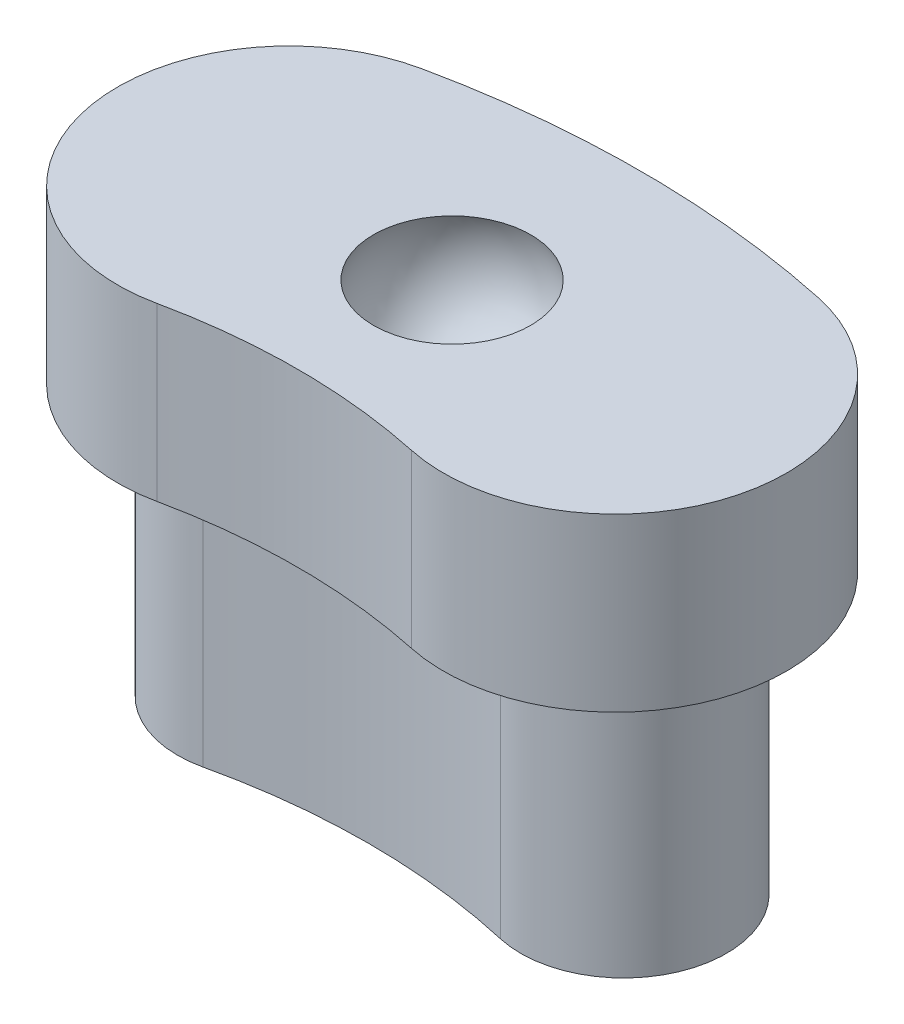
ISO-10303-21;
HEADER;
FILE_DESCRIPTION(('STEP AP214'),'2;1');
FILE_NAME('part.step','',(''),(''),'','','');
FILE_SCHEMA(('AUTOMOTIVE_DESIGN { 1 0 10303 214 1 1 1 1 }'));
ENDSEC;
DATA;
#1=APPLICATION_CONTEXT('core data for automotive mechanical design processes');
#2=APPLICATION_PROTOCOL_DEFINITION('international standard','automotive_design',2000,#1);
#3=PRODUCT_CONTEXT('',#1,'mechanical');
#4=PRODUCT('Part','Part','',(#3));
#5=PRODUCT_RELATED_PRODUCT_CATEGORY('part','',(#4));
#6=PRODUCT_DEFINITION_FORMATION('','',#4);
#7=PRODUCT_DEFINITION_CONTEXT('part definition',#1,'design');
#8=PRODUCT_DEFINITION('design','',#6,#7);
#9=PRODUCT_DEFINITION_SHAPE('','',#8);
#10=(LENGTH_UNIT() NAMED_UNIT(*) SI_UNIT(.MILLI.,.METRE.));
#11=(NAMED_UNIT(*) PLANE_ANGLE_UNIT() SI_UNIT($,.RADIAN.));
#12=(NAMED_UNIT(*) SI_UNIT($,.STERADIAN.) SOLID_ANGLE_UNIT());
#13=UNCERTAINTY_MEASURE_WITH_UNIT(LENGTH_MEASURE(1.E-05),#10,'distance_accuracy_value','');
#14=(GEOMETRIC_REPRESENTATION_CONTEXT(3) GLOBAL_UNCERTAINTY_ASSIGNED_CONTEXT((#13)) GLOBAL_UNIT_ASSIGNED_CONTEXT((#10,
#11,#12)) REPRESENTATION_CONTEXT('',''));
#15=CARTESIAN_POINT('',(0.,0.,0.));
#16=DIRECTION('',(0.,0.,1.));
#17=DIRECTION('',(1.,0.,0.));
#18=AXIS2_PLACEMENT_3D('',#15,#16,#17);
#19=CARTESIAN_POINT('',(4.75,5.,0.));
#20=DIRECTION('',(0.,-1.,0.));
#21=DIRECTION('',(0.,0.,-1.));
#22=AXIS2_PLACEMENT_3D('',#19,#20,#21);
#23=CYLINDRICAL_SURFACE('',#22,5.00000000000001);
#24=CARTESIAN_POINT('',(4.75,0.,0.));
#25=DIRECTION('',(0.,1.,0.));
#26=DIRECTION('',(0.,0.,1.));
#27=AXIS2_PLACEMENT_3D('',#24,#25,#26);
#28=CIRCLE('',#27,5.00000000000001);
#29=CARTESIAN_POINT('',(3.70890410958904,0.,4.89041095890411));
#30=VERTEX_POINT('',#29);
#31=CARTESIAN_POINT('',(5.79109589041095,0.,-4.89041095890412));
#32=VERTEX_POINT('',#31);
#33=EDGE_CURVE('E123',#30,#32,#28,.T.);
#34=ORIENTED_EDGE('',*,*,#33,.T.);
#35=DIRECTION('',(0.,-1.,0.));
#36=VECTOR('',#35,1.);
#37=CARTESIAN_POINT('',(5.79109589041095,5.,-4.89041095890412));
#38=LINE('',#37,#36);
#39=CARTESIAN_POINT('',(5.79109589041095,5.,-4.89041095890412));
#40=VERTEX_POINT('',#39);
#41=EDGE_CURVE('E11',#40,#32,#38,.T.);
#42=ORIENTED_EDGE('',*,*,#41,.F.);
#43=CARTESIAN_POINT('',(4.75,5.,0.));
#44=DIRECTION('',(0.,1.,0.));
#45=DIRECTION('',(0.,0.,1.));
#46=AXIS2_PLACEMENT_3D('',#43,#44,#45);
#47=CIRCLE('',#46,5.00000000000001);
#48=CARTESIAN_POINT('',(3.70890410958904,5.,4.89041095890411));
#49=VERTEX_POINT('',#48);
#50=EDGE_CURVE('E132',#49,#40,#47,.T.);
#51=ORIENTED_EDGE('',*,*,#50,.F.);
#52=DIRECTION('',(0.,-1.,0.));
#53=VECTOR('',#52,1.);
#54=CARTESIAN_POINT('',(3.70890410958904,5.,4.89041095890411));
#55=LINE('',#54,#53);
#56=EDGE_CURVE('E141',#49,#30,#55,.T.);
#57=ORIENTED_EDGE('',*,*,#56,.T.);
#58=EDGE_LOOP('',(#34,#42,#51,#57));
#59=FACE_BOUND('',#58,.T.);
#60=ADVANCED_FACE('F38',(#59),#23,.T.);
#61=CARTESIAN_POINT('',(0.,5.,22.3125));
#62=DIRECTION('',(0.,-1.,0.));
#63=DIRECTION('',(0.,0.,-1.));
#64=AXIS2_PLACEMENT_3D('',#61,#62,#63);
#65=CYLINDRICAL_SURFACE('',#64,27.8125);
#66=CARTESIAN_POINT('',(0.,0.,22.3125));
#67=DIRECTION('',(0.,1.,0.));
#68=DIRECTION('',(0.,0.,1.));
#69=AXIS2_PLACEMENT_3D('',#66,#67,#68);
#70=CIRCLE('',#69,27.8125);
#71=CARTESIAN_POINT('',(-5.79109589041095,0.,-4.89041095890412));
#72=VERTEX_POINT('',#71);
#73=EDGE_CURVE('E126',#32,#72,#70,.T.);
#74=ORIENTED_EDGE('',*,*,#73,.T.);
#75=DIRECTION('',(0.,-1.,0.));
#76=VECTOR('',#75,1.);
#77=CARTESIAN_POINT('',(-5.79109589041095,5.,-4.89041095890412));
#78=LINE('',#77,#76);
#79=CARTESIAN_POINT('',(-5.79109589041095,5.,-4.89041095890412));
#80=VERTEX_POINT('',#79);
#81=EDGE_CURVE('E46',#80,#72,#78,.T.);
#82=ORIENTED_EDGE('',*,*,#81,.F.);
#83=CARTESIAN_POINT('',(0.,5.,22.3125));
#84=DIRECTION('',(0.,1.,0.));
#85=DIRECTION('',(0.,0.,1.));
#86=AXIS2_PLACEMENT_3D('',#83,#84,#85);
#87=CIRCLE('',#86,27.8125);
#88=EDGE_CURVE('E135',#40,#80,#87,.T.);
#89=ORIENTED_EDGE('',*,*,#88,.F.);
#90=ORIENTED_EDGE('',*,*,#41,.T.);
#91=EDGE_LOOP('',(#74,#82,#89,#90));
#92=FACE_BOUND('',#91,.T.);
#93=ADVANCED_FACE('F173',(#92),#65,.T.);
#94=CARTESIAN_POINT('',(-4.75,5.,0.));
#95=DIRECTION('',(0.,-1.,0.));
#96=DIRECTION('',(0.,0.,-1.));
#97=AXIS2_PLACEMENT_3D('',#94,#95,#96);
#98=CYLINDRICAL_SURFACE('',#97,5.00000000000001);
#99=CARTESIAN_POINT('',(-4.75,0.,0.));
#100=DIRECTION('',(0.,1.,0.));
#101=DIRECTION('',(0.,0.,1.));
#102=AXIS2_PLACEMENT_3D('',#99,#100,#101);
#103=CIRCLE('',#102,5.00000000000001);
#104=CARTESIAN_POINT('',(-3.70890410958904,0.,4.89041095890412));
#105=VERTEX_POINT('',#104);
#106=EDGE_CURVE('E144',#72,#105,#103,.T.);
#107=ORIENTED_EDGE('',*,*,#106,.T.);
#108=DIRECTION('',(0.,-1.,0.));
#109=VECTOR('',#108,1.);
#110=CARTESIAN_POINT('',(-3.70890410958904,5.,4.89041095890412));
#111=LINE('',#110,#109);
#112=CARTESIAN_POINT('',(-3.70890410958904,5.,4.89041095890412));
#113=VERTEX_POINT('',#112);
#114=EDGE_CURVE('E149',#113,#105,#111,.T.);
#115=ORIENTED_EDGE('',*,*,#114,.F.);
#116=CARTESIAN_POINT('',(-4.75,5.,0.));
#117=DIRECTION('',(0.,1.,0.));
#118=DIRECTION('',(0.,0.,1.));
#119=AXIS2_PLACEMENT_3D('',#116,#117,#118);
#120=CIRCLE('',#119,5.00000000000001);
#121=EDGE_CURVE('E138',#80,#113,#120,.T.);
#122=ORIENTED_EDGE('',*,*,#121,.F.);
#123=ORIENTED_EDGE('',*,*,#81,.T.);
#124=EDGE_LOOP('',(#107,#115,#122,#123));
#125=FACE_BOUND('',#124,.T.);
#126=ADVANCED_FACE('F157',(#125),#98,.T.);
#127=CARTESIAN_POINT('',(0.,5.,22.3125));
#128=DIRECTION('',(0.,-1.,0.));
#129=DIRECTION('',(0.,0.,-1.));
#130=AXIS2_PLACEMENT_3D('',#127,#128,#129);
#131=CYLINDRICAL_SURFACE('',#130,17.8125);
#132=CARTESIAN_POINT('',(0.,0.,22.3125));
#133=DIRECTION('',(0.,-1.,0.));
#134=DIRECTION('',(0.,0.,1.));
#135=AXIS2_PLACEMENT_3D('',#132,#133,#134);
#136=CIRCLE('',#135,17.8125);
#137=EDGE_CURVE('E136',#105,#30,#136,.T.);
#138=ORIENTED_EDGE('',*,*,#137,.T.);
#139=ORIENTED_EDGE('',*,*,#56,.F.);
#140=CARTESIAN_POINT('',(0.,5.,22.3125));
#141=DIRECTION('',(0.,-1.,0.));
#142=DIRECTION('',(0.,0.,1.));
#143=AXIS2_PLACEMENT_3D('',#140,#141,#142);
#144=CIRCLE('',#143,17.8125);
#145=EDGE_CURVE('E140',#113,#49,#144,.T.);
#146=ORIENTED_EDGE('',*,*,#145,.F.);
#147=ORIENTED_EDGE('',*,*,#114,.T.);
#148=EDGE_LOOP('',(#138,#139,#146,#147));
#149=FACE_BOUND('',#148,.T.);
#150=ADVANCED_FACE('F166',(#149),#131,.F.);
#151=CARTESIAN_POINT('',(2.375,5.,11.15625));
#152=DIRECTION('',(0.,1.,0.));
#153=DIRECTION('',(0.,0.,1.));
#154=AXIS2_PLACEMENT_3D('',#151,#152,#153);
#155=PLANE('',#154);
#156=CARTESIAN_POINT('',(0.,5.,0.));
#157=DIRECTION('',(0.,1.,0.));
#158=DIRECTION('',(0.,0.,1.));
#159=AXIS2_PLACEMENT_3D('',#156,#157,#158);
#160=CIRCLE('',#159,2.29128784747792);
#161=CARTESIAN_POINT('',(0.,5.,2.29128784747792));
#162=VERTEX_POINT('',#161);
#163=EDGE_CURVE('E41',#162,#162,#160,.T.);
#164=ORIENTED_EDGE('',*,*,#163,.F.);
#165=EDGE_LOOP('',(#164));
#166=FACE_BOUND('',#165,.T.);
#167=ORIENTED_EDGE('',*,*,#50,.T.);
#168=ORIENTED_EDGE('',*,*,#88,.T.);
#169=ORIENTED_EDGE('',*,*,#121,.T.);
#170=ORIENTED_EDGE('',*,*,#145,.T.);
#171=EDGE_LOOP('',(#167,#168,#169,#170));
#172=FACE_BOUND('',#171,.T.);
#173=ADVANCED_FACE('F172',(#166,#172),#155,.T.);
#174=CARTESIAN_POINT('',(2.375,0.,11.15625));
#175=DIRECTION('',(0.,1.,0.));
#176=DIRECTION('',(0.,0.,1.));
#177=AXIS2_PLACEMENT_3D('',#174,#175,#176);
#178=PLANE('',#177);
#179=CARTESIAN_POINT('',(-5.,0.,0.));
#180=DIRECTION('',(0.,-1.,0.));
#181=DIRECTION('',(0.,0.,-1.));
#182=AXIS2_PLACEMENT_3D('',#179,#180,#181);
#183=CIRCLE('',#182,3.);
#184=CARTESIAN_POINT('',(-4.33333333333333,0.,2.92498812913072));
#185=VERTEX_POINT('',#184);
#186=CARTESIAN_POINT('',(-5.66666666666667,0.,-2.92498812913071));
#187=VERTEX_POINT('',#186);
#188=EDGE_CURVE('E53',#185,#187,#183,.T.);
#189=ORIENTED_EDGE('',*,*,#188,.F.);
#190=CARTESIAN_POINT('',(0.,0.,21.9374109684803));
#191=DIRECTION('',(0.,1.,0.));
#192=DIRECTION('',(0.,0.,-1.));
#193=AXIS2_PLACEMENT_3D('',#190,#191,#192);
#194=CIRCLE('',#193,19.5);
#195=CARTESIAN_POINT('',(4.33333333333334,0.,2.92498812913071));
#196=VERTEX_POINT('',#195);
#197=EDGE_CURVE('E57',#196,#185,#194,.T.);
#198=ORIENTED_EDGE('',*,*,#197,.F.);
#199=CARTESIAN_POINT('',(5.,0.,0.));
#200=DIRECTION('',(0.,-1.,0.));
#201=DIRECTION('',(0.,0.,-1.));
#202=AXIS2_PLACEMENT_3D('',#199,#200,#201);
#203=CIRCLE('',#202,3.);
#204=CARTESIAN_POINT('',(5.66666666666667,0.,-2.92498812913071));
#205=VERTEX_POINT('',#204);
#206=EDGE_CURVE('E211',#205,#196,#203,.T.);
#207=ORIENTED_EDGE('',*,*,#206,.F.);
#208=CARTESIAN_POINT('',(0.,0.,21.9374109684803));
#209=DIRECTION('',(0.,-1.,0.));
#210=DIRECTION('',(0.,0.,-1.));
#211=AXIS2_PLACEMENT_3D('',#208,#209,#210);
#212=CIRCLE('',#211,25.5);
#213=EDGE_CURVE('E209',#187,#205,#212,.T.);
#214=ORIENTED_EDGE('',*,*,#213,.F.);
#215=EDGE_LOOP('',(#189,#198,#207,#214));
#216=FACE_BOUND('',#215,.T.);
#217=ORIENTED_EDGE('',*,*,#33,.F.);
#218=ORIENTED_EDGE('',*,*,#137,.F.);
#219=ORIENTED_EDGE('',*,*,#106,.F.);
#220=ORIENTED_EDGE('',*,*,#73,.F.);
#221=EDGE_LOOP('',(#217,#218,#219,#220));
#222=FACE_BOUND('',#221,.T.);
#223=ADVANCED_FACE('F163',(#216,#222),#178,.F.);
#224=CARTESIAN_POINT('',(-5.,-8.,0.));
#225=DIRECTION('',(0.,1.,0.));
#226=DIRECTION('',(0.,0.,1.));
#227=AXIS2_PLACEMENT_3D('',#224,#225,#226);
#228=CYLINDRICAL_SURFACE('',#227,3.);
#229=ORIENTED_EDGE('',*,*,#188,.T.);
#230=DIRECTION('',(0.,1.,0.));
#231=VECTOR('',#230,1.);
#232=CARTESIAN_POINT('',(-5.66666666666667,-8.,-2.92498812913071));
#233=LINE('',#232,#231);
#234=CARTESIAN_POINT('',(-5.66666666666667,-8.,-2.92498812913071));
#235=VERTEX_POINT('',#234);
#236=EDGE_CURVE('E106',#235,#187,#233,.T.);
#237=ORIENTED_EDGE('',*,*,#236,.F.);
#238=CARTESIAN_POINT('',(-5.,-8.,0.));
#239=DIRECTION('',(0.,-1.,0.));
#240=DIRECTION('',(0.,0.,-1.));
#241=AXIS2_PLACEMENT_3D('',#238,#239,#240);
#242=CIRCLE('',#241,3.);
#243=CARTESIAN_POINT('',(-4.33333333333333,-8.,2.92498812913072));
#244=VERTEX_POINT('',#243);
#245=EDGE_CURVE('E112',#244,#235,#242,.T.);
#246=ORIENTED_EDGE('',*,*,#245,.F.);
#247=DIRECTION('',(0.,1.,0.));
#248=VECTOR('',#247,1.);
#249=CARTESIAN_POINT('',(-4.33333333333333,-8.,2.92498812913072));
#250=LINE('',#249,#248);
#251=EDGE_CURVE('E218',#244,#185,#250,.T.);
#252=ORIENTED_EDGE('',*,*,#251,.T.);
#253=EDGE_LOOP('',(#229,#237,#246,#252));
#254=FACE_BOUND('',#253,.T.);
#255=ADVANCED_FACE('F122',(#254),#228,.T.);
#256=CARTESIAN_POINT('',(0.,-8.,21.9374109684803));
#257=DIRECTION('',(0.,1.,0.));
#258=DIRECTION('',(0.,0.,1.));
#259=AXIS2_PLACEMENT_3D('',#256,#257,#258);
#260=CYLINDRICAL_SURFACE('',#259,25.5);
#261=ORIENTED_EDGE('',*,*,#213,.T.);
#262=DIRECTION('',(0.,1.,0.));
#263=VECTOR('',#262,1.);
#264=CARTESIAN_POINT('',(5.66666666666667,-8.,-2.92498812913071));
#265=LINE('',#264,#263);
#266=CARTESIAN_POINT('',(5.66666666666667,-8.,-2.92498812913071));
#267=VERTEX_POINT('',#266);
#268=EDGE_CURVE('E108',#267,#205,#265,.T.);
#269=ORIENTED_EDGE('',*,*,#268,.F.);
#270=CARTESIAN_POINT('',(0.,-8.,21.9374109684803));
#271=DIRECTION('',(0.,-1.,0.));
#272=DIRECTION('',(0.,0.,-1.));
#273=AXIS2_PLACEMENT_3D('',#270,#271,#272);
#274=CIRCLE('',#273,25.5);
#275=EDGE_CURVE('E101',#235,#267,#274,.T.);
#276=ORIENTED_EDGE('',*,*,#275,.F.);
#277=ORIENTED_EDGE('',*,*,#236,.T.);
#278=EDGE_LOOP('',(#261,#269,#276,#277));
#279=FACE_BOUND('',#278,.T.);
#280=ADVANCED_FACE('F104',(#279),#260,.T.);
#281=CARTESIAN_POINT('',(5.,-8.,0.));
#282=DIRECTION('',(0.,1.,0.));
#283=DIRECTION('',(0.,0.,1.));
#284=AXIS2_PLACEMENT_3D('',#281,#282,#283);
#285=CYLINDRICAL_SURFACE('',#284,3.);
#286=ORIENTED_EDGE('',*,*,#206,.T.);
#287=DIRECTION('',(0.,1.,0.));
#288=VECTOR('',#287,1.);
#289=CARTESIAN_POINT('',(4.33333333333334,-8.,2.92498812913071));
#290=LINE('',#289,#288);
#291=CARTESIAN_POINT('',(4.33333333333334,-8.,2.92498812913071));
#292=VERTEX_POINT('',#291);
#293=EDGE_CURVE('E128',#292,#196,#290,.T.);
#294=ORIENTED_EDGE('',*,*,#293,.F.);
#295=CARTESIAN_POINT('',(5.,-8.,0.));
#296=DIRECTION('',(0.,-1.,0.));
#297=DIRECTION('',(0.,0.,-1.));
#298=AXIS2_PLACEMENT_3D('',#295,#296,#297);
#299=CIRCLE('',#298,3.);
#300=EDGE_CURVE('E111',#267,#292,#299,.T.);
#301=ORIENTED_EDGE('',*,*,#300,.F.);
#302=ORIENTED_EDGE('',*,*,#268,.T.);
#303=EDGE_LOOP('',(#286,#294,#301,#302));
#304=FACE_BOUND('',#303,.T.);
#305=ADVANCED_FACE('F192',(#304),#285,.T.);
#306=CARTESIAN_POINT('',(0.,-8.,21.9374109684803));
#307=DIRECTION('',(0.,1.,0.));
#308=DIRECTION('',(0.,0.,1.));
#309=AXIS2_PLACEMENT_3D('',#306,#307,#308);
#310=CYLINDRICAL_SURFACE('',#309,19.5);
#311=ORIENTED_EDGE('',*,*,#197,.T.);
#312=ORIENTED_EDGE('',*,*,#251,.F.);
#313=CARTESIAN_POINT('',(0.,-8.,21.9374109684803));
#314=DIRECTION('',(0.,1.,0.));
#315=DIRECTION('',(0.,0.,-1.));
#316=AXIS2_PLACEMENT_3D('',#313,#314,#315);
#317=CIRCLE('',#316,19.5);
#318=EDGE_CURVE('E117',#292,#244,#317,.T.);
#319=ORIENTED_EDGE('',*,*,#318,.F.);
#320=ORIENTED_EDGE('',*,*,#293,.T.);
#321=EDGE_LOOP('',(#311,#312,#319,#320));
#322=FACE_BOUND('',#321,.T.);
#323=ADVANCED_FACE('F195',(#322),#310,.F.);
#324=CARTESIAN_POINT('',(-2.5,-8.,10.9687054842402));
#325=DIRECTION('',(0.,-1.,0.));
#326=DIRECTION('',(0.,0.,-1.));
#327=AXIS2_PLACEMENT_3D('',#324,#325,#326);
#328=PLANE('',#327);
#329=ORIENTED_EDGE('',*,*,#245,.T.);
#330=ORIENTED_EDGE('',*,*,#275,.T.);
#331=ORIENTED_EDGE('',*,*,#300,.T.);
#332=ORIENTED_EDGE('',*,*,#318,.T.);
#333=EDGE_LOOP('',(#329,#330,#331,#332));
#334=FACE_BOUND('',#333,.T.);
#335=ADVANCED_FACE('F115',(#334),#328,.T.);
#336=CARTESIAN_POINT('',(0.,4.,0.));
#337=DIRECTION('',(0.,0.,-1.));
#338=DIRECTION('',(1.,0.,0.));
#339=AXIS2_PLACEMENT_3D('',#336,#337,#338);
#340=SPHERICAL_SURFACE('',#339,2.5);
#341=CARTESIAN_POINT('',(0.,4.,0.));
#342=DIRECTION('',(0.,1.,0.));
#343=DIRECTION('',(0.,0.,1.));
#344=AXIS2_PLACEMENT_3D('',#341,#342,#343);
#345=SPHERICAL_SURFACE('',#344,2.5);
#346=ORIENTED_EDGE('',*,*,#163,.T.);
#347=EDGE_LOOP('',(#346));
#348=FACE_BOUND('',#347,.T.);
#349=ADVANCED_FACE('F202',(#348),#345,.F.);
#350=CLOSED_SHELL('',(#60,#93,#126,#150,#173,#223,#255,#280,#305,#323,#335,#349));
#351=MANIFOLD_SOLID_BREP('B2',#350);
#352=ADVANCED_BREP_SHAPE_REPRESENTATION('',(#18,#351),#14);
#353=SHAPE_DEFINITION_REPRESENTATION(#9,#352);
ENDSEC;
END-ISO-10303-21;
